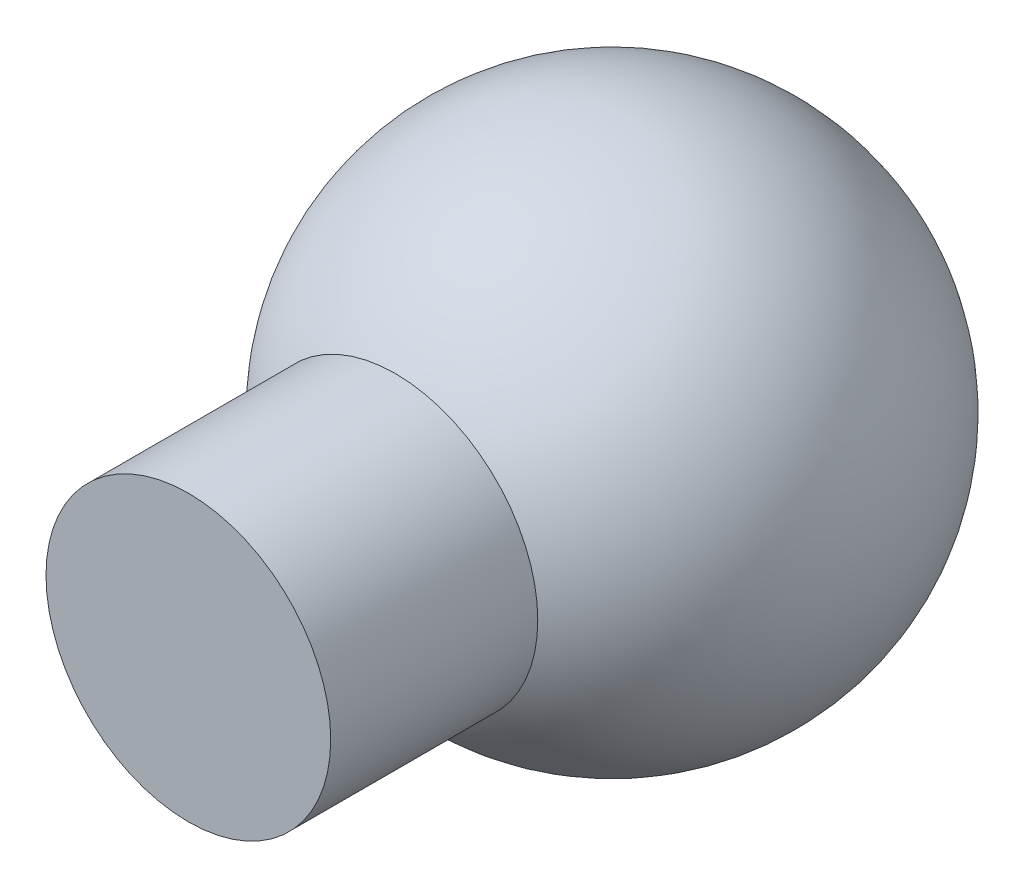
ISO-10303-21;
HEADER;
FILE_DESCRIPTION(('STEP AP214'),'2;1');
FILE_NAME('part.step','',(''),(''),'','','');
FILE_SCHEMA(('AUTOMOTIVE_DESIGN { 1 0 10303 214 1 1 1 1 }'));
ENDSEC;
DATA;
#1=APPLICATION_CONTEXT('core data for automotive mechanical design processes');
#2=APPLICATION_PROTOCOL_DEFINITION('international standard','automotive_design',2000,#1);
#3=PRODUCT_CONTEXT('',#1,'mechanical');
#4=PRODUCT('Part','Part','',(#3));
#5=PRODUCT_RELATED_PRODUCT_CATEGORY('part','',(#4));
#6=PRODUCT_DEFINITION_FORMATION('','',#4);
#7=PRODUCT_DEFINITION_CONTEXT('part definition',#1,'design');
#8=PRODUCT_DEFINITION('design','',#6,#7);
#9=PRODUCT_DEFINITION_SHAPE('','',#8);
#10=(LENGTH_UNIT() NAMED_UNIT(*) SI_UNIT(.MILLI.,.METRE.));
#11=(NAMED_UNIT(*) PLANE_ANGLE_UNIT() SI_UNIT($,.RADIAN.));
#12=(NAMED_UNIT(*) SI_UNIT($,.STERADIAN.) SOLID_ANGLE_UNIT());
#13=UNCERTAINTY_MEASURE_WITH_UNIT(LENGTH_MEASURE(1.E-05),#10,'distance_accuracy_value','');
#14=(GEOMETRIC_REPRESENTATION_CONTEXT(3) GLOBAL_UNCERTAINTY_ASSIGNED_CONTEXT((#13)) GLOBAL_UNIT_ASSIGNED_CONTEXT((#10,
#11,#12)) REPRESENTATION_CONTEXT('',''));
#15=CARTESIAN_POINT('',(0.,0.,0.));
#16=DIRECTION('',(0.,0.,1.));
#17=DIRECTION('',(1.,0.,0.));
#18=AXIS2_PLACEMENT_3D('',#15,#16,#17);
#19=CARTESIAN_POINT('',(0.,0.,15.));
#20=DIRECTION('',(0.,0.,-1.));
#21=DIRECTION('',(-1.,0.,0.));
#22=AXIS2_PLACEMENT_3D('',#19,#20,#21);
#23=CYLINDRICAL_SURFACE('',#22,5.5);
#24=CARTESIAN_POINT('',(0.,0.,0.));
#25=DIRECTION('',(0.,0.,1.));
#26=DIRECTION('',(1.,0.,0.));
#27=AXIS2_PLACEMENT_3D('',#24,#25,#26);
#28=CIRCLE('',#27,5.5);
#29=CARTESIAN_POINT('',(5.5,0.,0.));
#30=VERTEX_POINT('',#29);
#31=EDGE_CURVE('E10',#30,#30,#28,.T.);
#32=ORIENTED_EDGE('',*,*,#31,.T.);
#33=EDGE_LOOP('',(#32));
#34=FACE_BOUND('',#33,.T.);
#35=CARTESIAN_POINT('',(0.,0.,8.));
#36=DIRECTION('',(0.,0.,1.));
#37=DIRECTION('',(1.,0.,0.));
#38=AXIS2_PLACEMENT_3D('',#35,#36,#37);
#39=CIRCLE('',#38,5.5);
#40=CARTESIAN_POINT('',(5.5,0.,8.));
#41=VERTEX_POINT('',#40);
#42=EDGE_CURVE('E34',#41,#41,#39,.T.);
#43=ORIENTED_EDGE('',*,*,#42,.F.);
#44=EDGE_LOOP('',(#43));
#45=FACE_BOUND('',#44,.T.);
#46=ADVANCED_FACE('F31',(#34,#45),#23,.T.);
#47=CARTESIAN_POINT('',(0.,0.,0.));
#48=DIRECTION('',(0.,0.,1.));
#49=DIRECTION('',(1.,0.,0.));
#50=AXIS2_PLACEMENT_3D('',#47,#48,#49);
#51=PLANE('',#50);
#52=CARTESIAN_POINT('',(0.,0.,0.));
#53=DIRECTION('',(0.,0.,-1.));
#54=DIRECTION('',(-1.,0.,0.));
#55=AXIS2_PLACEMENT_3D('',#52,#53,#54);
#56=CIRCLE('',#55,5.46927192532134);
#57=CARTESIAN_POINT('',(-5.46927192532134,0.,0.));
#58=VERTEX_POINT('',#57);
#59=EDGE_CURVE('E38',#58,#58,#56,.T.);
#60=ORIENTED_EDGE('',*,*,#59,.F.);
#61=EDGE_LOOP('',(#60));
#62=FACE_BOUND('',#61,.T.);
#63=ORIENTED_EDGE('',*,*,#31,.F.);
#64=EDGE_LOOP('',(#63));
#65=FACE_BOUND('',#64,.T.);
#66=ADVANCED_FACE('F51',(#62,#65),#51,.F.);
#67=CARTESIAN_POINT('',(0.,0.,-8.37180175391724));
#68=DIRECTION('',(0.,0.,-1.));
#69=DIRECTION('',(1.,0.,0.));
#70=AXIS2_PLACEMENT_3D('',#67,#68,#69);
#71=SPHERICAL_SURFACE('',#70,9.99999999999999);
#72=ORIENTED_EDGE('',*,*,#59,.T.);
#73=EDGE_LOOP('',(#72));
#74=FACE_BOUND('',#73,.T.);
#75=ADVANCED_FACE('F55',(#74),#71,.T.);
#76=CARTESIAN_POINT('',(0.,0.,8.));
#77=DIRECTION('',(0.,0.,1.));
#78=DIRECTION('',(1.,0.,0.));
#79=AXIS2_PLACEMENT_3D('',#76,#77,#78);
#80=PLANE('',#79);
#81=ORIENTED_EDGE('',*,*,#42,.T.);
#82=EDGE_LOOP('',(#81));
#83=FACE_BOUND('',#82,.T.);
#84=ADVANCED_FACE('F48',(#83),#80,.T.);
#85=CLOSED_SHELL('',(#46,#66,#75,#84));
#86=MANIFOLD_SOLID_BREP('B2',#85);
#87=ADVANCED_BREP_SHAPE_REPRESENTATION('',(#18,#86),#14);
#88=SHAPE_DEFINITION_REPRESENTATION(#9,#87);
ENDSEC;
END-ISO-10303-21;
